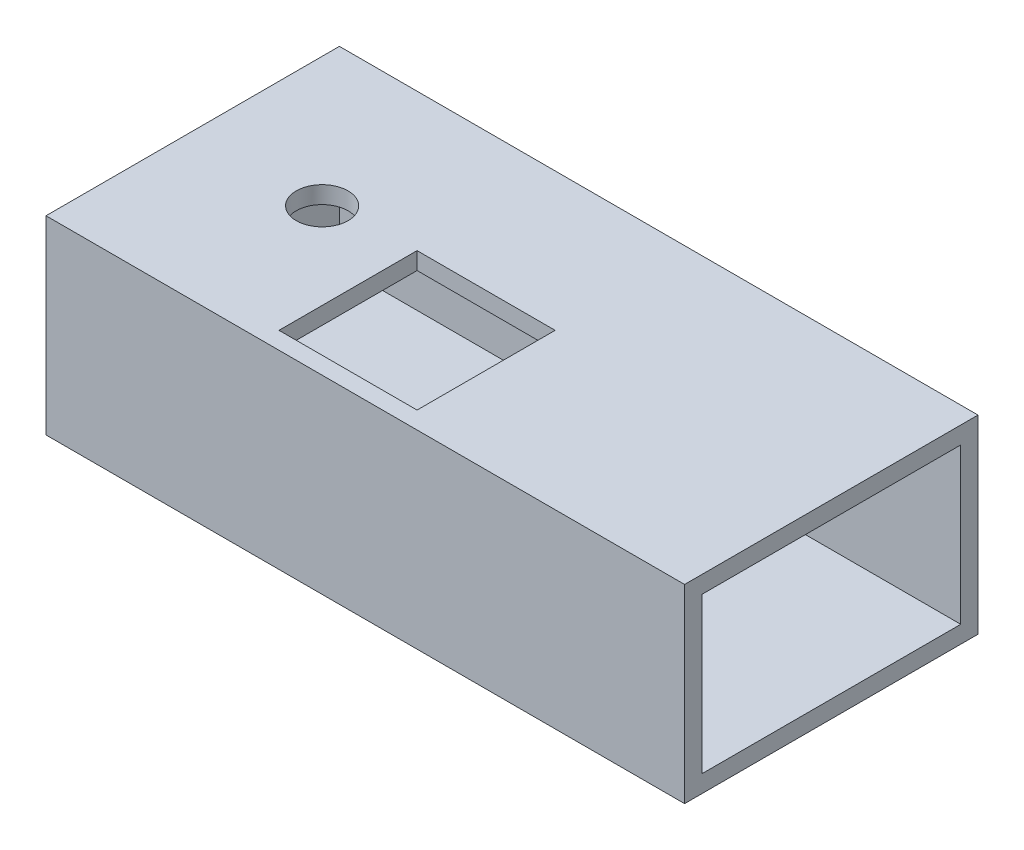
ISO-10303-21;
HEADER;
FILE_DESCRIPTION(('STEP AP214'),'2;1');
FILE_NAME('part.step','',(''),(''),'','','');
FILE_SCHEMA(('AUTOMOTIVE_DESIGN { 1 0 10303 214 1 1 1 1 }'));
ENDSEC;
DATA;
#1=APPLICATION_CONTEXT('core data for automotive mechanical design processes');
#2=APPLICATION_PROTOCOL_DEFINITION('international standard','automotive_design',2000,#1);
#3=PRODUCT_CONTEXT('',#1,'mechanical');
#4=PRODUCT('Part','Part','',(#3));
#5=PRODUCT_RELATED_PRODUCT_CATEGORY('part','',(#4));
#6=PRODUCT_DEFINITION_FORMATION('','',#4);
#7=PRODUCT_DEFINITION_CONTEXT('part definition',#1,'design');
#8=PRODUCT_DEFINITION('design','',#6,#7);
#9=PRODUCT_DEFINITION_SHAPE('','',#8);
#10=(LENGTH_UNIT() NAMED_UNIT(*) SI_UNIT(.MILLI.,.METRE.));
#11=(NAMED_UNIT(*) PLANE_ANGLE_UNIT() SI_UNIT($,.RADIAN.));
#12=(NAMED_UNIT(*) SI_UNIT($,.STERADIAN.) SOLID_ANGLE_UNIT());
#13=UNCERTAINTY_MEASURE_WITH_UNIT(LENGTH_MEASURE(1.E-05),#10,'distance_accuracy_value','');
#14=(GEOMETRIC_REPRESENTATION_CONTEXT(3) GLOBAL_UNCERTAINTY_ASSIGNED_CONTEXT((#13)) GLOBAL_UNIT_ASSIGNED_CONTEXT((#10,
#11,#12)) REPRESENTATION_CONTEXT('',''));
#15=CARTESIAN_POINT('',(0.,0.,0.));
#16=DIRECTION('',(0.,0.,1.));
#17=DIRECTION('',(1.,0.,0.));
#18=AXIS2_PLACEMENT_3D('',#15,#16,#17);
#19=CARTESIAN_POINT('',(18.5,11.,8.5));
#20=DIRECTION('',(-1.,0.,0.));
#21=DIRECTION('',(0.,0.,1.));
#22=AXIS2_PLACEMENT_3D('',#19,#20,#21);
#23=PLANE('',#22);
#24=DIRECTION('',(0.,0.,-1.));
#25=VECTOR('',#24,1.);
#26=CARTESIAN_POINT('',(18.5,0.,8.5));
#27=LINE('',#26,#25);
#28=CARTESIAN_POINT('',(18.5,0.,8.5));
#29=VERTEX_POINT('',#28);
#30=CARTESIAN_POINT('',(18.5,0.,-8.49999999999999));
#31=VERTEX_POINT('',#30);
#32=EDGE_CURVE('E285',#29,#31,#27,.T.);
#33=ORIENTED_EDGE('',*,*,#32,.T.);
#34=DIRECTION('',(0.,-1.,0.));
#35=VECTOR('',#34,1.);
#36=CARTESIAN_POINT('',(18.5,11.,-8.49999999999999));
#37=LINE('',#36,#35);
#38=CARTESIAN_POINT('',(18.5,11.,-8.49999999999999));
#39=VERTEX_POINT('',#38);
#40=EDGE_CURVE('E293',#39,#31,#37,.T.);
#41=ORIENTED_EDGE('',*,*,#40,.F.);
#42=DIRECTION('',(0.,0.,-1.));
#43=VECTOR('',#42,1.);
#44=CARTESIAN_POINT('',(18.5,11.,8.5));
#45=LINE('',#44,#43);
#46=CARTESIAN_POINT('',(18.5,11.,8.5));
#47=VERTEX_POINT('',#46);
#48=EDGE_CURVE('E272',#47,#39,#45,.T.);
#49=ORIENTED_EDGE('',*,*,#48,.F.);
#50=DIRECTION('',(0.,-1.,0.));
#51=VECTOR('',#50,1.);
#52=CARTESIAN_POINT('',(18.5,11.,8.5));
#53=LINE('',#52,#51);
#54=EDGE_CURVE('E297',#47,#29,#53,.T.);
#55=ORIENTED_EDGE('',*,*,#54,.T.);
#56=EDGE_LOOP('',(#33,#41,#49,#55));
#57=FACE_BOUND('',#56,.T.);
#58=DIRECTION('',(0.,0.,-1.));
#59=VECTOR('',#58,1.);
#60=CARTESIAN_POINT('',(18.5,1.,0.));
#61=LINE('',#60,#59);
#62=CARTESIAN_POINT('',(18.5,1.,7.5));
#63=VERTEX_POINT('',#62);
#64=CARTESIAN_POINT('',(18.5,1.,-7.49999999999999));
#65=VERTEX_POINT('',#64);
#66=EDGE_CURVE('E243',#63,#65,#61,.T.);
#67=ORIENTED_EDGE('',*,*,#66,.F.);
#68=DIRECTION('',(0.,-1.,0.));
#69=VECTOR('',#68,1.);
#70=CARTESIAN_POINT('',(18.5,11.,7.5));
#71=LINE('',#70,#69);
#72=CARTESIAN_POINT('',(18.5,10.,7.5));
#73=VERTEX_POINT('',#72);
#74=EDGE_CURVE('E228',#73,#63,#71,.T.);
#75=ORIENTED_EDGE('',*,*,#74,.F.);
#76=DIRECTION('',(0.,0.,-1.));
#77=VECTOR('',#76,1.);
#78=CARTESIAN_POINT('',(18.5,10.,0.));
#79=LINE('',#78,#77);
#80=CARTESIAN_POINT('',(18.5,10.,-7.49999999999999));
#81=VERTEX_POINT('',#80);
#82=EDGE_CURVE('E248',#73,#81,#79,.T.);
#83=ORIENTED_EDGE('',*,*,#82,.T.);
#84=DIRECTION('',(0.,-1.,0.));
#85=VECTOR('',#84,1.);
#86=CARTESIAN_POINT('',(18.5,11.,-7.49999999999999));
#87=LINE('',#86,#85);
#88=EDGE_CURVE('E239',#81,#65,#87,.T.);
#89=ORIENTED_EDGE('',*,*,#88,.T.);
#90=EDGE_LOOP('',(#67,#75,#83,#89));
#91=FACE_BOUND('',#90,.T.);
#92=ADVANCED_FACE('F39',(#57,#91),#23,.F.);
#93=CARTESIAN_POINT('',(-18.5,11.,8.5));
#94=DIRECTION('',(1.,0.,0.));
#95=DIRECTION('',(0.,0.,-1.));
#96=AXIS2_PLACEMENT_3D('',#93,#94,#95);
#97=PLANE('',#96);
#98=DIRECTION('',(0.,0.,-1.));
#99=VECTOR('',#98,1.);
#100=CARTESIAN_POINT('',(-18.5,9.5,-5.));
#101=LINE('',#100,#99);
#102=CARTESIAN_POINT('',(-18.5,9.5,5.));
#103=VERTEX_POINT('',#102);
#104=CARTESIAN_POINT('',(-18.5,9.5,-5.));
#105=VERTEX_POINT('',#104);
#106=EDGE_CURVE('E193',#103,#105,#101,.T.);
#107=ORIENTED_EDGE('',*,*,#106,.F.);
#108=DIRECTION('',(0.,1.,0.));
#109=VECTOR('',#108,1.);
#110=CARTESIAN_POINT('',(-18.5,6.,5.));
#111=LINE('',#110,#109);
#112=CARTESIAN_POINT('',(-18.5,6.,5.));
#113=VERTEX_POINT('',#112);
#114=EDGE_CURVE('E190',#113,#103,#111,.T.);
#115=ORIENTED_EDGE('',*,*,#114,.F.);
#116=DIRECTION('',(0.,0.,1.));
#117=VECTOR('',#116,1.);
#118=CARTESIAN_POINT('',(-18.5,6.,-5.));
#119=LINE('',#118,#117);
#120=CARTESIAN_POINT('',(-18.5,6.,-5.));
#121=VERTEX_POINT('',#120);
#122=EDGE_CURVE('E201',#121,#113,#119,.T.);
#123=ORIENTED_EDGE('',*,*,#122,.F.);
#124=DIRECTION('',(0.,-1.,0.));
#125=VECTOR('',#124,1.);
#126=CARTESIAN_POINT('',(-18.5,6.,-5.));
#127=LINE('',#126,#125);
#128=EDGE_CURVE('E197',#105,#121,#127,.T.);
#129=ORIENTED_EDGE('',*,*,#128,.F.);
#130=EDGE_LOOP('',(#107,#115,#123,#129));
#131=FACE_BOUND('',#130,.T.);
#132=DIRECTION('',(0.,0.,1.));
#133=VECTOR('',#132,1.);
#134=CARTESIAN_POINT('',(-18.5,0.,8.5));
#135=LINE('',#134,#133);
#136=CARTESIAN_POINT('',(-18.5,0.,-8.49999999999999));
#137=VERTEX_POINT('',#136);
#138=CARTESIAN_POINT('',(-18.5,0.,8.5));
#139=VERTEX_POINT('',#138);
#140=EDGE_CURVE('E227',#137,#139,#135,.T.);
#141=ORIENTED_EDGE('',*,*,#140,.T.);
#142=DIRECTION('',(0.,-1.,0.));
#143=VECTOR('',#142,1.);
#144=CARTESIAN_POINT('',(-18.5,11.,8.5));
#145=LINE('',#144,#143);
#146=CARTESIAN_POINT('',(-18.5,11.,8.5));
#147=VERTEX_POINT('',#146);
#148=EDGE_CURVE('E301',#147,#139,#145,.T.);
#149=ORIENTED_EDGE('',*,*,#148,.F.);
#150=DIRECTION('',(0.,0.,1.));
#151=VECTOR('',#150,1.);
#152=CARTESIAN_POINT('',(-18.5,11.,8.5));
#153=LINE('',#152,#151);
#154=CARTESIAN_POINT('',(-18.5,11.,-8.49999999999999));
#155=VERTEX_POINT('',#154);
#156=EDGE_CURVE('E264',#155,#147,#153,.T.);
#157=ORIENTED_EDGE('',*,*,#156,.F.);
#158=DIRECTION('',(0.,-1.,0.));
#159=VECTOR('',#158,1.);
#160=CARTESIAN_POINT('',(-18.5,11.,-8.49999999999999));
#161=LINE('',#160,#159);
#162=EDGE_CURVE('E278',#155,#137,#161,.T.);
#163=ORIENTED_EDGE('',*,*,#162,.T.);
#164=EDGE_LOOP('',(#141,#149,#157,#163));
#165=FACE_BOUND('',#164,.T.);
#166=ADVANCED_FACE('F41',(#131,#165),#97,.F.);
#167=CARTESIAN_POINT('',(-18.5,11.,8.5));
#168=DIRECTION('',(0.,0.,-1.));
#169=DIRECTION('',(-1.,0.,0.));
#170=AXIS2_PLACEMENT_3D('',#167,#168,#169);
#171=PLANE('',#170);
#172=DIRECTION('',(1.,0.,0.));
#173=VECTOR('',#172,1.);
#174=CARTESIAN_POINT('',(-18.5,0.,8.5));
#175=LINE('',#174,#173);
#176=EDGE_CURVE('E282',#139,#29,#175,.T.);
#177=ORIENTED_EDGE('',*,*,#176,.T.);
#178=ORIENTED_EDGE('',*,*,#54,.F.);
#179=DIRECTION('',(1.,0.,0.));
#180=VECTOR('',#179,1.);
#181=CARTESIAN_POINT('',(-18.5,11.,8.5));
#182=LINE('',#181,#180);
#183=EDGE_CURVE('E268',#147,#47,#182,.T.);
#184=ORIENTED_EDGE('',*,*,#183,.F.);
#185=ORIENTED_EDGE('',*,*,#148,.T.);
#186=EDGE_LOOP('',(#177,#178,#184,#185));
#187=FACE_BOUND('',#186,.T.);
#188=ADVANCED_FACE('F369',(#187),#171,.F.);
#189=CARTESIAN_POINT('',(-18.5,11.,-8.49999999999999));
#190=DIRECTION('',(0.,0.,1.));
#191=DIRECTION('',(1.,0.,0.));
#192=AXIS2_PLACEMENT_3D('',#189,#190,#191);
#193=PLANE('',#192);
#194=DIRECTION('',(-1.,0.,0.));
#195=VECTOR('',#194,1.);
#196=CARTESIAN_POINT('',(-18.5,0.,-8.49999999999999));
#197=LINE('',#196,#195);
#198=EDGE_CURVE('E269',#31,#137,#197,.T.);
#199=ORIENTED_EDGE('',*,*,#198,.T.);
#200=ORIENTED_EDGE('',*,*,#162,.F.);
#201=DIRECTION('',(-1.,0.,0.));
#202=VECTOR('',#201,1.);
#203=CARTESIAN_POINT('',(-18.5,11.,-8.49999999999999));
#204=LINE('',#203,#202);
#205=EDGE_CURVE('E275',#39,#155,#204,.T.);
#206=ORIENTED_EDGE('',*,*,#205,.F.);
#207=ORIENTED_EDGE('',*,*,#40,.T.);
#208=EDGE_LOOP('',(#199,#200,#206,#207));
#209=FACE_BOUND('',#208,.T.);
#210=ADVANCED_FACE('F372',(#209),#193,.F.);
#211=CARTESIAN_POINT('',(0.,11.,0.));
#212=DIRECTION('',(0.,-1.,0.));
#213=DIRECTION('',(0.,0.,-1.));
#214=AXIS2_PLACEMENT_3D('',#211,#212,#213);
#215=PLANE('',#214);
#216=DIRECTION('',(-1.,0.,0.));
#217=VECTOR('',#216,1.);
#218=CARTESIAN_POINT('',(2.,11.,-0.5));
#219=LINE('',#218,#217);
#220=CARTESIAN_POINT('',(2.,11.,-0.5));
#221=VERTEX_POINT('',#220);
#222=CARTESIAN_POINT('',(-6.,11.,-0.499999999999999));
#223=VERTEX_POINT('',#222);
#224=EDGE_CURVE('E163',#221,#223,#219,.T.);
#225=ORIENTED_EDGE('',*,*,#224,.F.);
#226=DIRECTION('',(0.,0.,-1.));
#227=VECTOR('',#226,1.);
#228=CARTESIAN_POINT('',(2.,11.,7.5));
#229=LINE('',#228,#227);
#230=CARTESIAN_POINT('',(2.,11.,7.5));
#231=VERTEX_POINT('',#230);
#232=EDGE_CURVE('E55',#231,#221,#229,.T.);
#233=ORIENTED_EDGE('',*,*,#232,.F.);
#234=DIRECTION('',(1.,0.,0.));
#235=VECTOR('',#234,1.);
#236=CARTESIAN_POINT('',(2.,11.,7.5));
#237=LINE('',#236,#235);
#238=CARTESIAN_POINT('',(-6.,11.,7.5));
#239=VERTEX_POINT('',#238);
#240=EDGE_CURVE('E171',#239,#231,#237,.T.);
#241=ORIENTED_EDGE('',*,*,#240,.F.);
#242=DIRECTION('',(0.,0.,1.));
#243=VECTOR('',#242,1.);
#244=CARTESIAN_POINT('',(-6.,11.,7.5));
#245=LINE('',#244,#243);
#246=EDGE_CURVE('E154',#223,#239,#245,.T.);
#247=ORIENTED_EDGE('',*,*,#246,.F.);
#248=EDGE_LOOP('',(#225,#233,#241,#247));
#249=FACE_BOUND('',#248,.T.);
#250=CARTESIAN_POINT('',(-11.,11.,0.));
#251=DIRECTION('',(0.,1.,0.));
#252=DIRECTION('',(0.,0.,1.));
#253=AXIS2_PLACEMENT_3D('',#250,#251,#252);
#254=CIRCLE('',#253,1.5);
#255=CARTESIAN_POINT('',(-11.,11.,1.5));
#256=VERTEX_POINT('',#255);
#257=EDGE_CURVE('E186',#256,#256,#254,.T.);
#258=ORIENTED_EDGE('',*,*,#257,.F.);
#259=EDGE_LOOP('',(#258));
#260=FACE_BOUND('',#259,.T.);
#261=ORIENTED_EDGE('',*,*,#156,.T.);
#262=ORIENTED_EDGE('',*,*,#183,.T.);
#263=ORIENTED_EDGE('',*,*,#48,.T.);
#264=ORIENTED_EDGE('',*,*,#205,.T.);
#265=EDGE_LOOP('',(#261,#262,#263,#264));
#266=FACE_BOUND('',#265,.T.);
#267=ADVANCED_FACE('F168',(#249,#260,#266),#215,.F.);
#268=CARTESIAN_POINT('',(0.,0.,0.));
#269=DIRECTION('',(0.,-1.,0.));
#270=DIRECTION('',(0.,0.,-1.));
#271=AXIS2_PLACEMENT_3D('',#268,#269,#270);
#272=PLANE('',#271);
#273=ORIENTED_EDGE('',*,*,#140,.F.);
#274=ORIENTED_EDGE('',*,*,#198,.F.);
#275=ORIENTED_EDGE('',*,*,#32,.F.);
#276=ORIENTED_EDGE('',*,*,#176,.F.);
#277=EDGE_LOOP('',(#273,#274,#275,#276));
#278=FACE_BOUND('',#277,.T.);
#279=ADVANCED_FACE('F388',(#278),#272,.T.);
#280=CARTESIAN_POINT('',(-17.5,11.,8.5));
#281=DIRECTION('',(1.,0.,0.));
#282=DIRECTION('',(0.,0.,-1.));
#283=AXIS2_PLACEMENT_3D('',#280,#281,#282);
#284=PLANE('',#283);
#285=DIRECTION('',(0.,-1.,0.));
#286=VECTOR('',#285,1.);
#287=CARTESIAN_POINT('',(-17.5,11.,5.));
#288=LINE('',#287,#286);
#289=CARTESIAN_POINT('',(-17.5,9.5,5.));
#290=VERTEX_POINT('',#289);
#291=CARTESIAN_POINT('',(-17.5,6.,5.));
#292=VERTEX_POINT('',#291);
#293=EDGE_CURVE('E315',#290,#292,#288,.T.);
#294=ORIENTED_EDGE('',*,*,#293,.F.);
#295=DIRECTION('',(0.,0.,1.));
#296=VECTOR('',#295,1.);
#297=CARTESIAN_POINT('',(-17.5,9.5,8.5));
#298=LINE('',#297,#296);
#299=CARTESIAN_POINT('',(-17.5,9.5,-5.));
#300=VERTEX_POINT('',#299);
#301=EDGE_CURVE('E305',#300,#290,#298,.T.);
#302=ORIENTED_EDGE('',*,*,#301,.F.);
#303=DIRECTION('',(0.,1.,0.));
#304=VECTOR('',#303,1.);
#305=CARTESIAN_POINT('',(-17.5,11.,-5.));
#306=LINE('',#305,#304);
#307=CARTESIAN_POINT('',(-17.5,6.,-5.));
#308=VERTEX_POINT('',#307);
#309=EDGE_CURVE('E308',#308,#300,#306,.T.);
#310=ORIENTED_EDGE('',*,*,#309,.F.);
#311=DIRECTION('',(0.,0.,-1.));
#312=VECTOR('',#311,1.);
#313=CARTESIAN_POINT('',(-17.5,6.,8.5));
#314=LINE('',#313,#312);
#315=EDGE_CURVE('E312',#292,#308,#314,.T.);
#316=ORIENTED_EDGE('',*,*,#315,.F.);
#317=EDGE_LOOP('',(#294,#302,#310,#316));
#318=FACE_BOUND('',#317,.T.);
#319=DIRECTION('',(0.,0.,1.));
#320=VECTOR('',#319,1.);
#321=CARTESIAN_POINT('',(-17.5,1.,0.));
#322=LINE('',#321,#320);
#323=CARTESIAN_POINT('',(-17.5,1.,-7.49999999999999));
#324=VERTEX_POINT('',#323);
#325=CARTESIAN_POINT('',(-17.5,1.,7.5));
#326=VERTEX_POINT('',#325);
#327=EDGE_CURVE('E209',#324,#326,#322,.T.);
#328=ORIENTED_EDGE('',*,*,#327,.F.);
#329=DIRECTION('',(0.,-1.,0.));
#330=VECTOR('',#329,1.);
#331=CARTESIAN_POINT('',(-17.5,11.,-7.49999999999999));
#332=LINE('',#331,#330);
#333=CARTESIAN_POINT('',(-17.5,10.,-7.49999999999999));
#334=VERTEX_POINT('',#333);
#335=EDGE_CURVE('E235',#334,#324,#332,.T.);
#336=ORIENTED_EDGE('',*,*,#335,.F.);
#337=DIRECTION('',(0.,0.,1.));
#338=VECTOR('',#337,1.);
#339=CARTESIAN_POINT('',(-17.5,10.,0.));
#340=LINE('',#339,#338);
#341=CARTESIAN_POINT('',(-17.5,10.,7.5));
#342=VERTEX_POINT('',#341);
#343=EDGE_CURVE('E229',#334,#342,#340,.T.);
#344=ORIENTED_EDGE('',*,*,#343,.T.);
#345=DIRECTION('',(0.,-1.,0.));
#346=VECTOR('',#345,1.);
#347=CARTESIAN_POINT('',(-17.5,11.,7.5));
#348=LINE('',#347,#346);
#349=EDGE_CURVE('E223',#342,#326,#348,.T.);
#350=ORIENTED_EDGE('',*,*,#349,.T.);
#351=EDGE_LOOP('',(#328,#336,#344,#350));
#352=FACE_BOUND('',#351,.T.);
#353=ADVANCED_FACE('F347',(#318,#352),#284,.T.);
#354=CARTESIAN_POINT('',(-18.5,11.,7.5));
#355=DIRECTION('',(0.,0.,-1.));
#356=DIRECTION('',(-1.,0.,0.));
#357=AXIS2_PLACEMENT_3D('',#354,#355,#356);
#358=PLANE('',#357);
#359=DIRECTION('',(1.,0.,0.));
#360=VECTOR('',#359,1.);
#361=CARTESIAN_POINT('',(0.,10.,7.5));
#362=LINE('',#361,#360);
#363=CARTESIAN_POINT('',(-6.,10.,7.5));
#364=VERTEX_POINT('',#363);
#365=EDGE_CURVE('E244',#342,#364,#362,.T.);
#366=ORIENTED_EDGE('',*,*,#365,.T.);
#367=DIRECTION('',(0.,1.,0.));
#368=VECTOR('',#367,1.);
#369=CARTESIAN_POINT('',(-6.,9.,7.5));
#370=LINE('',#369,#368);
#371=EDGE_CURVE('E159',#364,#239,#370,.T.);
#372=ORIENTED_EDGE('',*,*,#371,.T.);
#373=ORIENTED_EDGE('',*,*,#240,.T.);
#374=DIRECTION('',(0.,1.,0.));
#375=VECTOR('',#374,1.);
#376=CARTESIAN_POINT('',(2.,9.,7.5));
#377=LINE('',#376,#375);
#378=CARTESIAN_POINT('',(2.,10.,7.5));
#379=VERTEX_POINT('',#378);
#380=EDGE_CURVE('E178',#379,#231,#377,.T.);
#381=ORIENTED_EDGE('',*,*,#380,.F.);
#382=EDGE_CURVE('E233',#379,#73,#362,.T.);
#383=ORIENTED_EDGE('',*,*,#382,.T.);
#384=ORIENTED_EDGE('',*,*,#74,.T.);
#385=DIRECTION('',(1.,0.,0.));
#386=VECTOR('',#385,1.);
#387=CARTESIAN_POINT('',(0.,1.,7.5));
#388=LINE('',#387,#386);
#389=EDGE_CURVE('E222',#326,#63,#388,.T.);
#390=ORIENTED_EDGE('',*,*,#389,.F.);
#391=ORIENTED_EDGE('',*,*,#349,.F.);
#392=EDGE_LOOP('',(#366,#372,#373,#381,#383,#384,#390,#391));
#393=FACE_BOUND('',#392,.T.);
#394=ADVANCED_FACE('F329',(#393),#358,.T.);
#395=CARTESIAN_POINT('',(-18.5,11.,-7.49999999999999));
#396=DIRECTION('',(0.,0.,1.));
#397=DIRECTION('',(1.,0.,0.));
#398=AXIS2_PLACEMENT_3D('',#395,#396,#397);
#399=PLANE('',#398);
#400=DIRECTION('',(-1.,0.,0.));
#401=VECTOR('',#400,1.);
#402=CARTESIAN_POINT('',(0.,1.,-7.49999999999999));
#403=LINE('',#402,#401);
#404=EDGE_CURVE('E234',#65,#324,#403,.T.);
#405=ORIENTED_EDGE('',*,*,#404,.F.);
#406=ORIENTED_EDGE('',*,*,#88,.F.);
#407=DIRECTION('',(-1.,0.,0.));
#408=VECTOR('',#407,1.);
#409=CARTESIAN_POINT('',(0.,10.,-7.49999999999999));
#410=LINE('',#409,#408);
#411=EDGE_CURVE('E240',#81,#334,#410,.T.);
#412=ORIENTED_EDGE('',*,*,#411,.T.);
#413=ORIENTED_EDGE('',*,*,#335,.T.);
#414=EDGE_LOOP('',(#405,#406,#412,#413));
#415=FACE_BOUND('',#414,.T.);
#416=ADVANCED_FACE('F343',(#415),#399,.T.);
#417=CARTESIAN_POINT('',(0.,10.,0.));
#418=DIRECTION('',(0.,-1.,0.));
#419=DIRECTION('',(0.,0.,-1.));
#420=AXIS2_PLACEMENT_3D('',#417,#418,#419);
#421=PLANE('',#420);
#422=DIRECTION('',(0.,0.,1.));
#423=VECTOR('',#422,1.);
#424=CARTESIAN_POINT('',(2.,10.,0.));
#425=LINE('',#424,#423);
#426=CARTESIAN_POINT('',(2.,10.,-0.5));
#427=VERTEX_POINT('',#426);
#428=EDGE_CURVE('E11',#427,#379,#425,.T.);
#429=ORIENTED_EDGE('',*,*,#428,.F.);
#430=DIRECTION('',(1.,0.,0.));
#431=VECTOR('',#430,1.);
#432=CARTESIAN_POINT('',(0.,10.,-0.499999999999999));
#433=LINE('',#432,#431);
#434=CARTESIAN_POINT('',(-6.,10.,-0.499999999999999));
#435=VERTEX_POINT('',#434);
#436=EDGE_CURVE('E318',#435,#427,#433,.T.);
#437=ORIENTED_EDGE('',*,*,#436,.F.);
#438=DIRECTION('',(0.,0.,-1.));
#439=VECTOR('',#438,1.);
#440=CARTESIAN_POINT('',(-6.,10.,0.));
#441=LINE('',#440,#439);
#442=EDGE_CURVE('E48',#364,#435,#441,.T.);
#443=ORIENTED_EDGE('',*,*,#442,.F.);
#444=ORIENTED_EDGE('',*,*,#365,.F.);
#445=ORIENTED_EDGE('',*,*,#343,.F.);
#446=ORIENTED_EDGE('',*,*,#411,.F.);
#447=ORIENTED_EDGE('',*,*,#82,.F.);
#448=ORIENTED_EDGE('',*,*,#382,.F.);
#449=EDGE_LOOP('',(#429,#437,#443,#444,#445,#446,#447,#448));
#450=FACE_BOUND('',#449,.T.);
#451=CARTESIAN_POINT('',(-11.,10.,0.));
#452=DIRECTION('',(0.,-1.,0.));
#453=DIRECTION('',(0.,0.,-1.));
#454=AXIS2_PLACEMENT_3D('',#451,#452,#453);
#455=CIRCLE('',#454,1.5);
#456=CARTESIAN_POINT('',(-11.,10.,-1.5));
#457=VERTEX_POINT('',#456);
#458=EDGE_CURVE('E181',#457,#457,#455,.T.);
#459=ORIENTED_EDGE('',*,*,#458,.F.);
#460=EDGE_LOOP('',(#459));
#461=FACE_BOUND('',#460,.T.);
#462=ADVANCED_FACE('F335',(#450,#461),#421,.T.);
#463=CARTESIAN_POINT('',(0.,1.,0.));
#464=DIRECTION('',(0.,-1.,0.));
#465=DIRECTION('',(0.,0.,-1.));
#466=AXIS2_PLACEMENT_3D('',#463,#464,#465);
#467=PLANE('',#466);
#468=ORIENTED_EDGE('',*,*,#327,.T.);
#469=ORIENTED_EDGE('',*,*,#389,.T.);
#470=ORIENTED_EDGE('',*,*,#66,.T.);
#471=ORIENTED_EDGE('',*,*,#404,.T.);
#472=EDGE_LOOP('',(#468,#469,#470,#471));
#473=FACE_BOUND('',#472,.T.);
#474=ADVANCED_FACE('F341',(#473),#467,.F.);
#475=CARTESIAN_POINT('',(-7.5,6.,5.));
#476=DIRECTION('',(0.,0.,1.));
#477=DIRECTION('',(1.,0.,0.));
#478=AXIS2_PLACEMENT_3D('',#475,#476,#477);
#479=PLANE('',#478);
#480=ORIENTED_EDGE('',*,*,#293,.T.);
#481=DIRECTION('',(-1.,0.,0.));
#482=VECTOR('',#481,1.);
#483=CARTESIAN_POINT('',(-7.5,6.,5.));
#484=LINE('',#483,#482);
#485=EDGE_CURVE('E206',#292,#113,#484,.T.);
#486=ORIENTED_EDGE('',*,*,#485,.T.);
#487=ORIENTED_EDGE('',*,*,#114,.T.);
#488=DIRECTION('',(-1.,0.,0.));
#489=VECTOR('',#488,1.);
#490=CARTESIAN_POINT('',(-7.5,9.5,5.));
#491=LINE('',#490,#489);
#492=EDGE_CURVE('E205',#290,#103,#491,.T.);
#493=ORIENTED_EDGE('',*,*,#492,.F.);
#494=EDGE_LOOP('',(#480,#486,#487,#493));
#495=FACE_BOUND('',#494,.T.);
#496=ADVANCED_FACE('F402',(#495),#479,.F.);
#497=CARTESIAN_POINT('',(-7.5,6.,-5.));
#498=DIRECTION('',(0.,-1.,0.));
#499=DIRECTION('',(0.,0.,-1.));
#500=AXIS2_PLACEMENT_3D('',#497,#498,#499);
#501=PLANE('',#500);
#502=ORIENTED_EDGE('',*,*,#315,.T.);
#503=DIRECTION('',(-1.,0.,0.));
#504=VECTOR('',#503,1.);
#505=CARTESIAN_POINT('',(-7.5,6.,-5.));
#506=LINE('',#505,#504);
#507=EDGE_CURVE('E210',#308,#121,#506,.T.);
#508=ORIENTED_EDGE('',*,*,#507,.T.);
#509=ORIENTED_EDGE('',*,*,#122,.T.);
#510=ORIENTED_EDGE('',*,*,#485,.F.);
#511=EDGE_LOOP('',(#502,#508,#509,#510));
#512=FACE_BOUND('',#511,.T.);
#513=ADVANCED_FACE('F414',(#512),#501,.F.);
#514=CARTESIAN_POINT('',(-7.5,6.,-5.));
#515=DIRECTION('',(0.,0.,-1.));
#516=DIRECTION('',(-1.,0.,0.));
#517=AXIS2_PLACEMENT_3D('',#514,#515,#516);
#518=PLANE('',#517);
#519=ORIENTED_EDGE('',*,*,#309,.T.);
#520=DIRECTION('',(-1.,0.,0.));
#521=VECTOR('',#520,1.);
#522=CARTESIAN_POINT('',(-7.5,9.5,-5.));
#523=LINE('',#522,#521);
#524=EDGE_CURVE('E213',#300,#105,#523,.T.);
#525=ORIENTED_EDGE('',*,*,#524,.T.);
#526=ORIENTED_EDGE('',*,*,#128,.T.);
#527=ORIENTED_EDGE('',*,*,#507,.F.);
#528=EDGE_LOOP('',(#519,#525,#526,#527));
#529=FACE_BOUND('',#528,.T.);
#530=ADVANCED_FACE('F418',(#529),#518,.F.);
#531=CARTESIAN_POINT('',(-7.5,9.5,-5.));
#532=DIRECTION('',(0.,1.,0.));
#533=DIRECTION('',(0.,0.,1.));
#534=AXIS2_PLACEMENT_3D('',#531,#532,#533);
#535=PLANE('',#534);
#536=ORIENTED_EDGE('',*,*,#301,.T.);
#537=ORIENTED_EDGE('',*,*,#492,.T.);
#538=ORIENTED_EDGE('',*,*,#106,.T.);
#539=ORIENTED_EDGE('',*,*,#524,.F.);
#540=EDGE_LOOP('',(#536,#537,#538,#539));
#541=FACE_BOUND('',#540,.T.);
#542=ADVANCED_FACE('F359',(#541),#535,.F.);
#543=CARTESIAN_POINT('',(-11.,9.,0.));
#544=DIRECTION('',(0.,1.,0.));
#545=DIRECTION('',(0.,0.,1.));
#546=AXIS2_PLACEMENT_3D('',#543,#544,#545);
#547=CYLINDRICAL_SURFACE('',#546,1.5);
#548=ORIENTED_EDGE('',*,*,#458,.T.);
#549=EDGE_LOOP('',(#548));
#550=FACE_BOUND('',#549,.T.);
#551=ORIENTED_EDGE('',*,*,#257,.T.);
#552=EDGE_LOOP('',(#551));
#553=FACE_BOUND('',#552,.T.);
#554=ADVANCED_FACE('F352',(#550,#553),#547,.F.);
#555=CARTESIAN_POINT('',(2.,9.,7.5));
#556=DIRECTION('',(1.,0.,0.));
#557=DIRECTION('',(0.,0.,-1.));
#558=AXIS2_PLACEMENT_3D('',#555,#556,#557);
#559=PLANE('',#558);
#560=ORIENTED_EDGE('',*,*,#428,.T.);
#561=ORIENTED_EDGE('',*,*,#380,.T.);
#562=ORIENTED_EDGE('',*,*,#232,.T.);
#563=DIRECTION('',(0.,1.,0.));
#564=VECTOR('',#563,1.);
#565=CARTESIAN_POINT('',(2.,9.,-0.5));
#566=LINE('',#565,#564);
#567=EDGE_CURVE('E160',#427,#221,#566,.T.);
#568=ORIENTED_EDGE('',*,*,#567,.F.);
#569=EDGE_LOOP('',(#560,#561,#562,#568));
#570=FACE_BOUND('',#569,.T.);
#571=ADVANCED_FACE('F349',(#570),#559,.F.);
#572=CARTESIAN_POINT('',(-6.,9.,7.5));
#573=DIRECTION('',(-1.,0.,0.));
#574=DIRECTION('',(0.,0.,1.));
#575=AXIS2_PLACEMENT_3D('',#572,#573,#574);
#576=PLANE('',#575);
#577=ORIENTED_EDGE('',*,*,#442,.T.);
#578=DIRECTION('',(0.,1.,0.));
#579=VECTOR('',#578,1.);
#580=CARTESIAN_POINT('',(-6.,9.,-0.499999999999999));
#581=LINE('',#580,#579);
#582=EDGE_CURVE('E63',#435,#223,#581,.T.);
#583=ORIENTED_EDGE('',*,*,#582,.T.);
#584=ORIENTED_EDGE('',*,*,#246,.T.);
#585=ORIENTED_EDGE('',*,*,#371,.F.);
#586=EDGE_LOOP('',(#577,#583,#584,#585));
#587=FACE_BOUND('',#586,.T.);
#588=ADVANCED_FACE('F152',(#587),#576,.F.);
#589=CARTESIAN_POINT('',(2.,9.,-0.5));
#590=DIRECTION('',(0.,0.,-1.));
#591=DIRECTION('',(-1.,0.,0.));
#592=AXIS2_PLACEMENT_3D('',#589,#590,#591);
#593=PLANE('',#592);
#594=ORIENTED_EDGE('',*,*,#436,.T.);
#595=ORIENTED_EDGE('',*,*,#567,.T.);
#596=ORIENTED_EDGE('',*,*,#224,.T.);
#597=ORIENTED_EDGE('',*,*,#582,.F.);
#598=EDGE_LOOP('',(#594,#595,#596,#597));
#599=FACE_BOUND('',#598,.T.);
#600=ADVANCED_FACE('F164',(#599),#593,.F.);
#601=CLOSED_SHELL('',(#92,#166,#188,#210,#267,#279,#353,#394,#416,#462,#474,#496,#513,#530,#542,
#554,#571,#588,#600));
#602=MANIFOLD_SOLID_BREP('B2',#601);
#603=ADVANCED_BREP_SHAPE_REPRESENTATION('',(#18,#602),#14);
#604=SHAPE_DEFINITION_REPRESENTATION(#9,#603);
ENDSEC;
END-ISO-10303-21;
